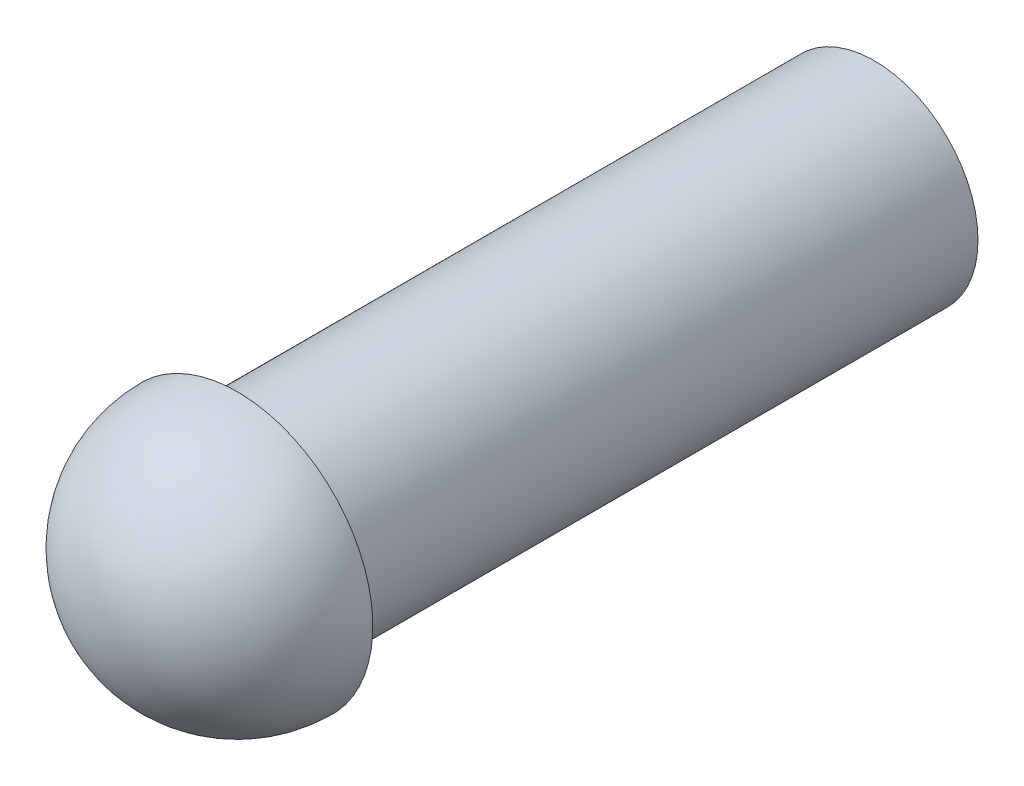
ISO-10303-21;
HEADER;
FILE_DESCRIPTION(('STEP AP214'),'2;1');
FILE_NAME('part.step','',(''),(''),'','','');
FILE_SCHEMA(('AUTOMOTIVE_DESIGN { 1 0 10303 214 1 1 1 1 }'));
ENDSEC;
DATA;
#1=APPLICATION_CONTEXT('core data for automotive mechanical design processes');
#2=APPLICATION_PROTOCOL_DEFINITION('international standard','automotive_design',2000,#1);
#3=PRODUCT_CONTEXT('',#1,'mechanical');
#4=PRODUCT('Part','Part','',(#3));
#5=PRODUCT_RELATED_PRODUCT_CATEGORY('part','',(#4));
#6=PRODUCT_DEFINITION_FORMATION('','',#4);
#7=PRODUCT_DEFINITION_CONTEXT('part definition',#1,'design');
#8=PRODUCT_DEFINITION('design','',#6,#7);
#9=PRODUCT_DEFINITION_SHAPE('','',#8);
#10=(LENGTH_UNIT() NAMED_UNIT(*) SI_UNIT(.MILLI.,.METRE.));
#11=(NAMED_UNIT(*) PLANE_ANGLE_UNIT() SI_UNIT($,.RADIAN.));
#12=(NAMED_UNIT(*) SI_UNIT($,.STERADIAN.) SOLID_ANGLE_UNIT());
#13=UNCERTAINTY_MEASURE_WITH_UNIT(LENGTH_MEASURE(1.E-05),#10,'distance_accuracy_value','');
#14=(GEOMETRIC_REPRESENTATION_CONTEXT(3) GLOBAL_UNCERTAINTY_ASSIGNED_CONTEXT((#13)) GLOBAL_UNIT_ASSIGNED_CONTEXT((#10,
#11,#12)) REPRESENTATION_CONTEXT('',''));
#15=CARTESIAN_POINT('',(0.,0.,0.));
#16=DIRECTION('',(0.,0.,1.));
#17=DIRECTION('',(1.,0.,0.));
#18=AXIS2_PLACEMENT_3D('',#15,#16,#17);
#19=CARTESIAN_POINT('',(0.,0.,20.));
#20=DIRECTION('',(0.,0.,-1.));
#21=DIRECTION('',(-1.,0.,0.));
#22=AXIS2_PLACEMENT_3D('',#19,#20,#21);
#23=CYLINDRICAL_SURFACE('',#22,3.25);
#24=CARTESIAN_POINT('',(0.,0.,20.));
#25=DIRECTION('',(0.,0.,1.));
#26=DIRECTION('',(1.,0.,0.));
#27=AXIS2_PLACEMENT_3D('',#24,#25,#26);
#28=CIRCLE('',#27,3.25);
#29=CARTESIAN_POINT('',(3.25,0.,20.));
#30=VERTEX_POINT('',#29);
#31=EDGE_CURVE('E10',#30,#30,#28,.T.);
#32=ORIENTED_EDGE('',*,*,#31,.F.);
#33=EDGE_LOOP('',(#32));
#34=FACE_BOUND('',#33,.T.);
#35=CARTESIAN_POINT('',(0.,0.,0.));
#36=DIRECTION('',(0.,0.,1.));
#37=DIRECTION('',(1.,0.,0.));
#38=AXIS2_PLACEMENT_3D('',#35,#36,#37);
#39=CIRCLE('',#38,3.25);
#40=CARTESIAN_POINT('',(3.25,0.,0.));
#41=VERTEX_POINT('',#40);
#42=EDGE_CURVE('E40',#41,#41,#39,.T.);
#43=ORIENTED_EDGE('',*,*,#42,.T.);
#44=EDGE_LOOP('',(#43));
#45=FACE_BOUND('',#44,.T.);
#46=ADVANCED_FACE('F37',(#34,#45),#23,.T.);
#47=CARTESIAN_POINT('',(0.,0.,0.));
#48=DIRECTION('',(0.,0.,1.));
#49=DIRECTION('',(1.,0.,0.));
#50=AXIS2_PLACEMENT_3D('',#47,#48,#49);
#51=PLANE('',#50);
#52=ORIENTED_EDGE('',*,*,#42,.F.);
#53=EDGE_LOOP('',(#52));
#54=FACE_BOUND('',#53,.T.);
#55=ADVANCED_FACE('F56',(#54),#51,.F.);
#56=CARTESIAN_POINT('',(0.,0.,20.));
#57=DIRECTION('',(0.,-1.,0.));
#58=DIRECTION('',(1.,0.,0.));
#59=AXIS2_PLACEMENT_3D('',#56,#57,#58);
#60=SPHERICAL_SURFACE('',#59,4.25);
#61=CARTESIAN_POINT('',(0.,0.,20.));
#62=DIRECTION('',(0.,0.,-1.));
#63=DIRECTION('',(-1.,0.,0.));
#64=AXIS2_PLACEMENT_3D('',#61,#62,#63);
#65=SPHERICAL_SURFACE('',#64,4.25);
#66=CARTESIAN_POINT('',(0.,0.,20.));
#67=DIRECTION('',(0.,0.,-1.));
#68=DIRECTION('',(-1.,0.,0.));
#69=AXIS2_PLACEMENT_3D('',#66,#67,#68);
#70=CIRCLE('',#69,4.25);
#71=CARTESIAN_POINT('',(-4.25,0.,20.));
#72=VERTEX_POINT('',#71);
#73=EDGE_CURVE('E47',#72,#72,#70,.T.);
#74=ORIENTED_EDGE('',*,*,#73,.F.);
#75=EDGE_LOOP('',(#74));
#76=FACE_BOUND('',#75,.T.);
#77=ADVANCED_FACE('F54',(#76),#65,.T.);
#78=CARTESIAN_POINT('',(0.,0.,20.));
#79=DIRECTION('',(0.,0.,-1.));
#80=DIRECTION('',(-1.,0.,0.));
#81=AXIS2_PLACEMENT_3D('',#78,#79,#80);
#82=PLANE('',#81);
#83=ORIENTED_EDGE('',*,*,#31,.T.);
#84=EDGE_LOOP('',(#83));
#85=FACE_BOUND('',#84,.T.);
#86=ORIENTED_EDGE('',*,*,#73,.T.);
#87=EDGE_LOOP('',(#86));
#88=FACE_BOUND('',#87,.T.);
#89=ADVANCED_FACE('F52',(#85,#88),#82,.T.);
#90=CLOSED_SHELL('',(#46,#55,#77,#89));
#91=MANIFOLD_SOLID_BREP('B2',#90);
#92=ADVANCED_BREP_SHAPE_REPRESENTATION('',(#18,#91),#14);
#93=SHAPE_DEFINITION_REPRESENTATION(#9,#92);
ENDSEC;
END-ISO-10303-21;
